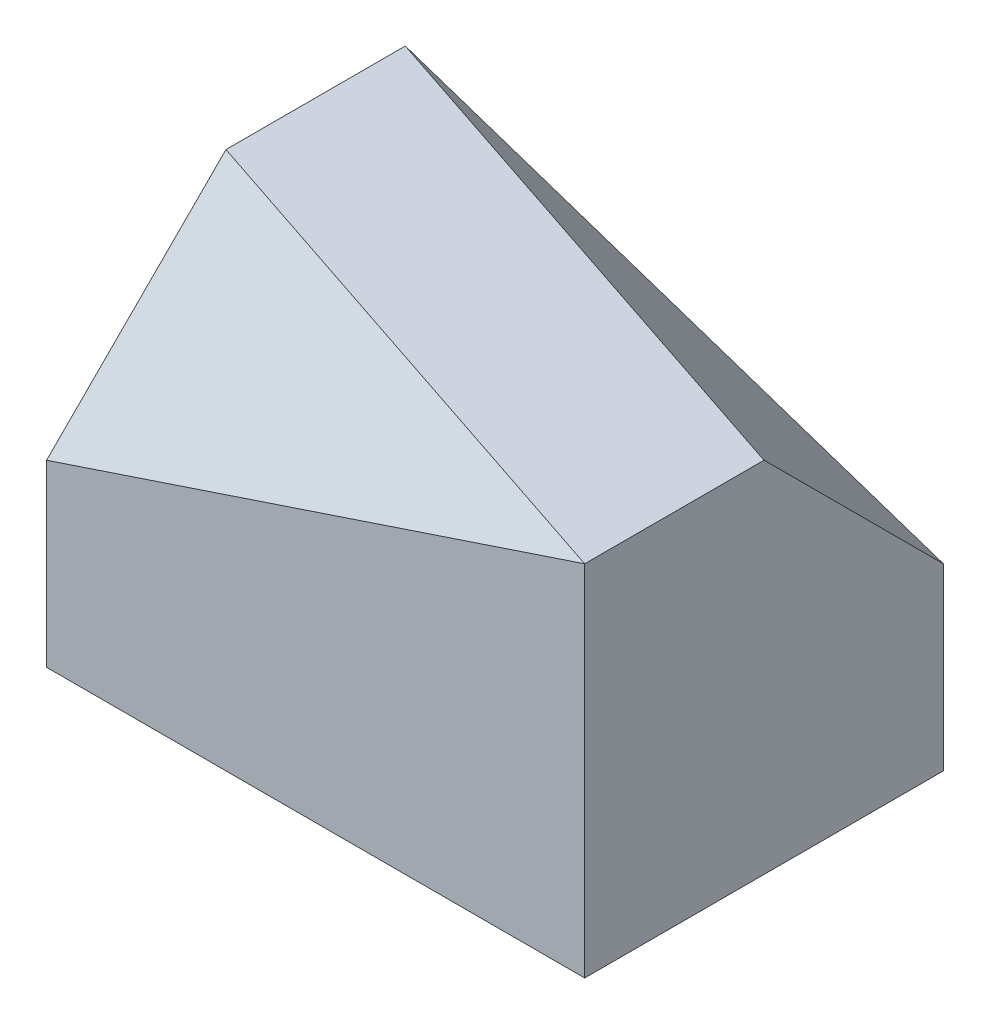
ISO-10303-21;
HEADER;
FILE_DESCRIPTION(('STEP AP214'),'2;1');
FILE_NAME('part.step','',(''),(''),'','','');
FILE_SCHEMA(('AUTOMOTIVE_DESIGN { 1 0 10303 214 1 1 1 1 }'));
ENDSEC;
DATA;
#1=APPLICATION_CONTEXT('core data for automotive mechanical design processes');
#2=APPLICATION_PROTOCOL_DEFINITION('international standard','automotive_design',2000,#1);
#3=PRODUCT_CONTEXT('',#1,'mechanical');
#4=PRODUCT('Part','Part','',(#3));
#5=PRODUCT_RELATED_PRODUCT_CATEGORY('part','',(#4));
#6=PRODUCT_DEFINITION_FORMATION('','',#4);
#7=PRODUCT_DEFINITION_CONTEXT('part definition',#1,'design');
#8=PRODUCT_DEFINITION('design','',#6,#7);
#9=PRODUCT_DEFINITION_SHAPE('','',#8);
#10=(LENGTH_UNIT() NAMED_UNIT(*) SI_UNIT(.MILLI.,.METRE.));
#11=(NAMED_UNIT(*) PLANE_ANGLE_UNIT() SI_UNIT($,.RADIAN.));
#12=(NAMED_UNIT(*) SI_UNIT($,.STERADIAN.) SOLID_ANGLE_UNIT());
#13=UNCERTAINTY_MEASURE_WITH_UNIT(LENGTH_MEASURE(1.E-05),#10,'distance_accuracy_value','');
#14=(GEOMETRIC_REPRESENTATION_CONTEXT(3) GLOBAL_UNCERTAINTY_ASSIGNED_CONTEXT((#13)) GLOBAL_UNIT_ASSIGNED_CONTEXT((#10,
#11,#12)) REPRESENTATION_CONTEXT('',''));
#15=CARTESIAN_POINT('',(0.,0.,0.));
#16=DIRECTION('',(0.,0.,1.));
#17=DIRECTION('',(1.,0.,0.));
#18=AXIS2_PLACEMENT_3D('',#15,#16,#17);
#19=CARTESIAN_POINT('',(60.,0.,0.));
#20=DIRECTION('',(1.,0.,0.));
#21=DIRECTION('',(0.,0.,-1.));
#22=AXIS2_PLACEMENT_3D('',#19,#20,#21);
#23=PLANE('',#22);
#24=DIRECTION('',(0.,1.,0.));
#25=VECTOR('',#24,1.);
#26=CARTESIAN_POINT('',(60.,20.,-20.));
#27=LINE('',#26,#25);
#28=CARTESIAN_POINT('',(60.,-20.,-20.));
#29=VERTEX_POINT('',#28);
#30=CARTESIAN_POINT('',(60.,0.,-20.));
#31=VERTEX_POINT('',#30);
#32=EDGE_CURVE('E93',#29,#31,#27,.T.);
#33=ORIENTED_EDGE('',*,*,#32,.T.);
#34=DIRECTION('',(0.,0.707106781186547,0.707106781186548));
#35=VECTOR('',#34,1.);
#36=CARTESIAN_POINT('',(60.,10.,-9.99999999999999));
#37=LINE('',#36,#35);
#38=CARTESIAN_POINT('',(60.,20.,0.));
#39=VERTEX_POINT('',#38);
#40=EDGE_CURVE('E11',#31,#39,#37,.T.);
#41=ORIENTED_EDGE('',*,*,#40,.T.);
#42=DIRECTION('',(0.,0.,1.));
#43=VECTOR('',#42,1.);
#44=CARTESIAN_POINT('',(60.,20.,20.));
#45=LINE('',#44,#43);
#46=CARTESIAN_POINT('',(60.,20.,20.));
#47=VERTEX_POINT('',#46);
#48=EDGE_CURVE('E102',#39,#47,#45,.T.);
#49=ORIENTED_EDGE('',*,*,#48,.T.);
#50=DIRECTION('',(0.,-1.,0.));
#51=VECTOR('',#50,1.);
#52=CARTESIAN_POINT('',(60.,20.,20.));
#53=LINE('',#52,#51);
#54=CARTESIAN_POINT('',(60.,-20.,20.));
#55=VERTEX_POINT('',#54);
#56=EDGE_CURVE('E107',#47,#55,#53,.T.);
#57=ORIENTED_EDGE('',*,*,#56,.T.);
#58=DIRECTION('',(0.,0.,-1.));
#59=VECTOR('',#58,1.);
#60=CARTESIAN_POINT('',(60.,-20.,20.));
#61=LINE('',#60,#59);
#62=EDGE_CURVE('E99',#55,#29,#61,.T.);
#63=ORIENTED_EDGE('',*,*,#62,.T.);
#64=EDGE_LOOP('',(#33,#41,#49,#57,#63));
#65=FACE_BOUND('',#64,.T.);
#66=ADVANCED_FACE('F39',(#65),#23,.T.);
#67=CARTESIAN_POINT('',(60.,20.,-20.));
#68=DIRECTION('',(0.,0.,1.));
#69=DIRECTION('',(0.,-1.,0.));
#70=AXIS2_PLACEMENT_3D('',#67,#68,#69);
#71=PLANE('',#70);
#72=DIRECTION('',(-0.948683298050514,0.316227766016838,0.));
#73=VECTOR('',#72,1.);
#74=CARTESIAN_POINT('',(54.,2.,-20.));
#75=LINE('',#74,#73);
#76=CARTESIAN_POINT('',(0.,20.,-20.));
#77=VERTEX_POINT('',#76);
#78=EDGE_CURVE('E85',#31,#77,#75,.T.);
#79=ORIENTED_EDGE('',*,*,#78,.F.);
#80=ORIENTED_EDGE('',*,*,#32,.F.);
#81=DIRECTION('',(-1.,0.,0.));
#82=VECTOR('',#81,1.);
#83=CARTESIAN_POINT('',(60.,-20.,-20.));
#84=LINE('',#83,#82);
#85=CARTESIAN_POINT('',(0.,-20.,-20.));
#86=VERTEX_POINT('',#85);
#87=EDGE_CURVE('E116',#29,#86,#84,.T.);
#88=ORIENTED_EDGE('',*,*,#87,.T.);
#89=DIRECTION('',(0.,1.,0.));
#90=VECTOR('',#89,1.);
#91=CARTESIAN_POINT('',(0.,20.,-20.));
#92=LINE('',#91,#90);
#93=EDGE_CURVE('E95',#86,#77,#92,.T.);
#94=ORIENTED_EDGE('',*,*,#93,.T.);
#95=EDGE_LOOP('',(#79,#80,#88,#94));
#96=FACE_BOUND('',#95,.T.);
#97=ADVANCED_FACE('F41',(#96),#71,.F.);
#98=CARTESIAN_POINT('',(60.,20.,20.));
#99=DIRECTION('',(0.,-1.,0.));
#100=DIRECTION('',(0.,0.,-1.));
#101=AXIS2_PLACEMENT_3D('',#98,#99,#100);
#102=PLANE('',#101);
#103=DIRECTION('',(0.948683298050514,0.,0.316227766016838));
#104=VECTOR('',#103,1.);
#105=CARTESIAN_POINT('',(66.,20.,2.00000000000002));
#106=LINE('',#105,#104);
#107=EDGE_CURVE('E48',#77,#39,#106,.T.);
#108=ORIENTED_EDGE('',*,*,#107,.F.);
#109=DIRECTION('',(0.,0.,1.));
#110=VECTOR('',#109,1.);
#111=CARTESIAN_POINT('',(0.,20.,20.));
#112=LINE('',#111,#110);
#113=CARTESIAN_POINT('',(0.,20.,0.));
#114=VERTEX_POINT('',#113);
#115=EDGE_CURVE('E119',#77,#114,#112,.T.);
#116=ORIENTED_EDGE('',*,*,#115,.T.);
#117=DIRECTION('',(-0.948683298050514,0.,-0.316227766016838));
#118=VECTOR('',#117,1.);
#119=CARTESIAN_POINT('',(60.,20.,20.));
#120=LINE('',#119,#118);
#121=EDGE_CURVE('E130',#47,#114,#120,.T.);
#122=ORIENTED_EDGE('',*,*,#121,.F.);
#123=ORIENTED_EDGE('',*,*,#48,.F.);
#124=EDGE_LOOP('',(#108,#116,#122,#123));
#125=FACE_BOUND('',#124,.T.);
#126=ADVANCED_FACE('F146',(#125),#102,.F.);
#127=CARTESIAN_POINT('',(60.,20.,20.));
#128=DIRECTION('',(0.,0.,-1.));
#129=DIRECTION('',(0.,1.,0.));
#130=AXIS2_PLACEMENT_3D('',#127,#128,#129);
#131=PLANE('',#130);
#132=DIRECTION('',(0.948683298050514,0.316227766016838,0.));
#133=VECTOR('',#132,1.);
#134=CARTESIAN_POINT('',(60.,20.,20.));
#135=LINE('',#134,#133);
#136=CARTESIAN_POINT('',(0.,0.,20.));
#137=VERTEX_POINT('',#136);
#138=EDGE_CURVE('E134',#137,#47,#135,.T.);
#139=ORIENTED_EDGE('',*,*,#138,.F.);
#140=DIRECTION('',(0.,-1.,0.));
#141=VECTOR('',#140,1.);
#142=CARTESIAN_POINT('',(0.,20.,20.));
#143=LINE('',#142,#141);
#144=CARTESIAN_POINT('',(0.,-20.,20.));
#145=VERTEX_POINT('',#144);
#146=EDGE_CURVE('E109',#137,#145,#143,.T.);
#147=ORIENTED_EDGE('',*,*,#146,.T.);
#148=DIRECTION('',(-1.,0.,0.));
#149=VECTOR('',#148,1.);
#150=CARTESIAN_POINT('',(60.,-20.,20.));
#151=LINE('',#150,#149);
#152=EDGE_CURVE('E126',#55,#145,#151,.T.);
#153=ORIENTED_EDGE('',*,*,#152,.F.);
#154=ORIENTED_EDGE('',*,*,#56,.F.);
#155=EDGE_LOOP('',(#139,#147,#153,#154));
#156=FACE_BOUND('',#155,.T.);
#157=ADVANCED_FACE('F149',(#156),#131,.F.);
#158=CARTESIAN_POINT('',(60.,-20.,20.));
#159=DIRECTION('',(0.,1.,0.));
#160=DIRECTION('',(0.,0.,1.));
#161=AXIS2_PLACEMENT_3D('',#158,#159,#160);
#162=PLANE('',#161);
#163=DIRECTION('',(0.,0.,-1.));
#164=VECTOR('',#163,1.);
#165=CARTESIAN_POINT('',(0.,-20.,20.));
#166=LINE('',#165,#164);
#167=EDGE_CURVE('E103',#145,#86,#166,.T.);
#168=ORIENTED_EDGE('',*,*,#167,.T.);
#169=ORIENTED_EDGE('',*,*,#87,.F.);
#170=ORIENTED_EDGE('',*,*,#62,.F.);
#171=ORIENTED_EDGE('',*,*,#152,.T.);
#172=EDGE_LOOP('',(#168,#169,#170,#171));
#173=FACE_BOUND('',#172,.T.);
#174=ADVANCED_FACE('F152',(#173),#162,.F.);
#175=CARTESIAN_POINT('',(0.,0.,0.));
#176=DIRECTION('',(1.,0.,0.));
#177=DIRECTION('',(0.,0.,-1.));
#178=AXIS2_PLACEMENT_3D('',#175,#176,#177);
#179=PLANE('',#178);
#180=DIRECTION('',(0.,-0.707106781186548,0.707106781186547));
#181=VECTOR('',#180,1.);
#182=CARTESIAN_POINT('',(0.,10.,10.));
#183=LINE('',#182,#181);
#184=EDGE_CURVE('E61',#114,#137,#183,.T.);
#185=ORIENTED_EDGE('',*,*,#184,.F.);
#186=ORIENTED_EDGE('',*,*,#115,.F.);
#187=ORIENTED_EDGE('',*,*,#93,.F.);
#188=ORIENTED_EDGE('',*,*,#167,.F.);
#189=ORIENTED_EDGE('',*,*,#146,.F.);
#190=EDGE_LOOP('',(#185,#186,#187,#188,#189));
#191=FACE_BOUND('',#190,.T.);
#192=ADVANCED_FACE('F153',(#191),#179,.F.);
#193=CARTESIAN_POINT('',(-3.15789473684211,9.47368421052632,9.47368421052632));
#194=DIRECTION('',(-0.229415733870562,0.688247201611685,0.688247201611685));
#195=DIRECTION('',(0.,-0.707106781186548,0.707106781186547));
#196=AXIS2_PLACEMENT_3D('',#193,#194,#195);
#197=PLANE('',#196);
#198=ORIENTED_EDGE('',*,*,#138,.T.);
#199=ORIENTED_EDGE('',*,*,#121,.T.);
#200=ORIENTED_EDGE('',*,*,#184,.T.);
#201=EDGE_LOOP('',(#198,#199,#200));
#202=FACE_BOUND('',#201,.T.);
#203=ADVANCED_FACE('F141',(#202),#197,.T.);
#204=CARTESIAN_POINT('',(6.31578947368421,18.9473684210526,-18.9473684210526));
#205=DIRECTION('',(0.229415733870562,0.688247201611685,-0.688247201611685));
#206=DIRECTION('',(0.,0.707106781186547,0.707106781186548));
#207=AXIS2_PLACEMENT_3D('',#204,#205,#206);
#208=PLANE('',#207);
#209=ORIENTED_EDGE('',*,*,#40,.F.);
#210=ORIENTED_EDGE('',*,*,#78,.T.);
#211=ORIENTED_EDGE('',*,*,#107,.T.);
#212=EDGE_LOOP('',(#209,#210,#211));
#213=FACE_BOUND('',#212,.T.);
#214=ADVANCED_FACE('F84',(#213),#208,.T.);
#215=CLOSED_SHELL('',(#66,#97,#126,#157,#174,#192,#203,#214));
#216=MANIFOLD_SOLID_BREP('B2',#215);
#217=ADVANCED_BREP_SHAPE_REPRESENTATION('',(#18,#216),#14);
#218=SHAPE_DEFINITION_REPRESENTATION(#9,#217);
ENDSEC;
END-ISO-10303-21;
